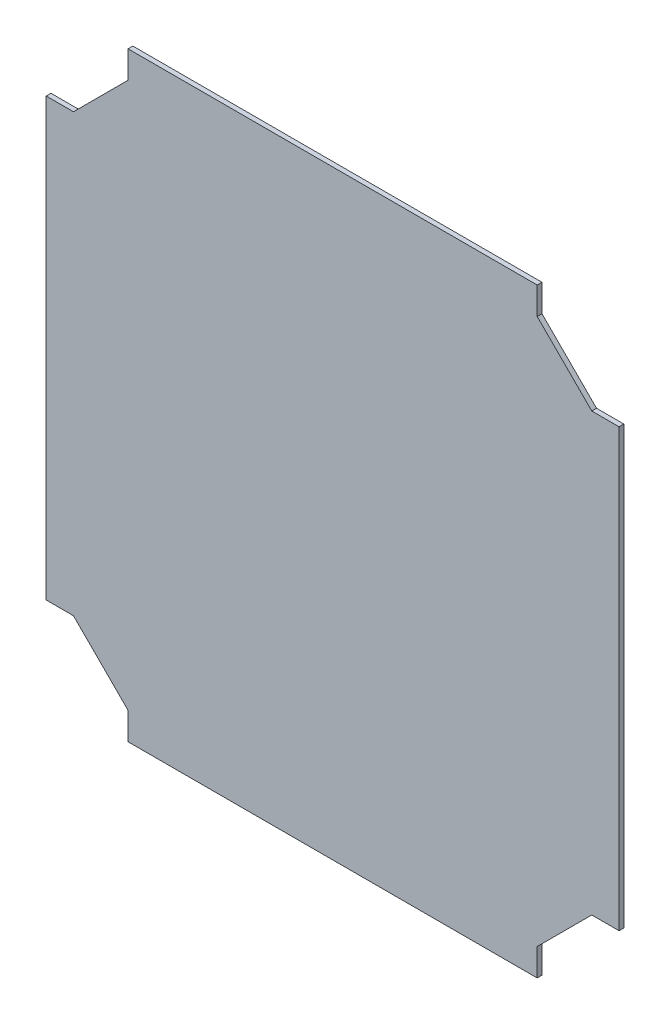
ISO-10303-21;
HEADER;
FILE_DESCRIPTION(('STEP AP214'),'2;1');
FILE_NAME('part.step','',(''),(''),'','','');
FILE_SCHEMA(('AUTOMOTIVE_DESIGN { 1 0 10303 214 1 1 1 1 }'));
ENDSEC;
DATA;
#1=APPLICATION_CONTEXT('core data for automotive mechanical design processes');
#2=APPLICATION_PROTOCOL_DEFINITION('international standard','automotive_design',2000,#1);
#3=PRODUCT_CONTEXT('',#1,'mechanical');
#4=PRODUCT('Part','Part','',(#3));
#5=PRODUCT_RELATED_PRODUCT_CATEGORY('part','',(#4));
#6=PRODUCT_DEFINITION_FORMATION('','',#4);
#7=PRODUCT_DEFINITION_CONTEXT('part definition',#1,'design');
#8=PRODUCT_DEFINITION('design','',#6,#7);
#9=PRODUCT_DEFINITION_SHAPE('','',#8);
#10=(LENGTH_UNIT() NAMED_UNIT(*) SI_UNIT(.MILLI.,.METRE.));
#11=(NAMED_UNIT(*) PLANE_ANGLE_UNIT() SI_UNIT($,.RADIAN.));
#12=(NAMED_UNIT(*) SI_UNIT($,.STERADIAN.) SOLID_ANGLE_UNIT());
#13=UNCERTAINTY_MEASURE_WITH_UNIT(LENGTH_MEASURE(1.E-05),#10,'distance_accuracy_value','');
#14=(GEOMETRIC_REPRESENTATION_CONTEXT(3) GLOBAL_UNCERTAINTY_ASSIGNED_CONTEXT((#13)) GLOBAL_UNIT_ASSIGNED_CONTEXT((#10,
#11,#12)) REPRESENTATION_CONTEXT('',''));
#15=CARTESIAN_POINT('',(0.,0.,0.));
#16=DIRECTION('',(0.,0.,1.));
#17=DIRECTION('',(1.,0.,0.));
#18=AXIS2_PLACEMENT_3D('',#15,#16,#17);
#19=CARTESIAN_POINT('',(-74.4468485132246,419.999999999776,3.5));
#20=DIRECTION('',(1.,1.5404344466475E-13,0.));
#21=DIRECTION('',(-1.5404344466475E-13,1.,0.));
#22=AXIS2_PLACEMENT_3D('',#19,#20,#21);
#23=PLANE('',#22);
#24=DIRECTION('',(1.5404344466475E-13,-1.,0.));
#25=VECTOR('',#24,1.);
#26=CARTESIAN_POINT('',(-74.4468485132246,419.999999999776,0.));
#27=LINE('',#26,#25);
#28=CARTESIAN_POINT('',(-74.4468485132277,440.000000000034,0.));
#29=VERTEX_POINT('',#28);
#30=CARTESIAN_POINT('',(-74.4468485132246,419.999999999776,0.));
#31=VERTEX_POINT('',#30);
#32=EDGE_CURVE('E176',#29,#31,#27,.T.);
#33=ORIENTED_EDGE('',*,*,#32,.T.);
#34=DIRECTION('',(0.,0.,-1.));
#35=VECTOR('',#34,1.);
#36=CARTESIAN_POINT('',(-74.4468485132246,419.999999999776,3.5));
#37=LINE('',#36,#35);
#38=CARTESIAN_POINT('',(-74.4468485132246,419.999999999776,3.5));
#39=VERTEX_POINT('',#38);
#40=EDGE_CURVE('E11',#39,#31,#37,.T.);
#41=ORIENTED_EDGE('',*,*,#40,.F.);
#42=DIRECTION('',(1.5404344466475E-13,-1.,0.));
#43=VECTOR('',#42,1.);
#44=CARTESIAN_POINT('',(-74.4468485132246,419.999999999776,3.5));
#45=LINE('',#44,#43);
#46=CARTESIAN_POINT('',(-74.4468485132277,440.000000000034,3.5));
#47=VERTEX_POINT('',#46);
#48=EDGE_CURVE('E207',#47,#39,#45,.T.);
#49=ORIENTED_EDGE('',*,*,#48,.F.);
#50=DIRECTION('',(0.,0.,-1.));
#51=VECTOR('',#50,1.);
#52=CARTESIAN_POINT('',(-74.4468485132277,440.000000000034,3.5));
#53=LINE('',#52,#51);
#54=EDGE_CURVE('E172',#47,#29,#53,.T.);
#55=ORIENTED_EDGE('',*,*,#54,.T.);
#56=EDGE_LOOP('',(#33,#41,#49,#55));
#57=FACE_BOUND('',#56,.T.);
#58=ADVANCED_FACE('F32',(#57),#23,.F.);
#59=CARTESIAN_POINT('',(-114.446848512919,380.000000000058,3.5));
#60=DIRECTION('',(0.707106781186745,-0.70710678118635,0.));
#61=DIRECTION('',(0.70710678118635,0.707106781186745,0.));
#62=AXIS2_PLACEMENT_3D('',#59,#60,#61);
#63=PLANE('',#62);
#64=DIRECTION('',(-0.70710678118635,-0.707106781186745,0.));
#65=VECTOR('',#64,1.);
#66=CARTESIAN_POINT('',(-114.446848512919,380.000000000058,0.));
#67=LINE('',#66,#65);
#68=CARTESIAN_POINT('',(-114.446848512919,380.000000000058,0.));
#69=VERTEX_POINT('',#68);
#70=EDGE_CURVE('E179',#31,#69,#67,.T.);
#71=ORIENTED_EDGE('',*,*,#70,.T.);
#72=DIRECTION('',(0.,0.,-1.));
#73=VECTOR('',#72,1.);
#74=CARTESIAN_POINT('',(-114.446848512919,380.000000000058,3.5));
#75=LINE('',#74,#73);
#76=CARTESIAN_POINT('',(-114.446848512919,380.000000000058,3.5));
#77=VERTEX_POINT('',#76);
#78=EDGE_CURVE('E40',#77,#69,#75,.T.);
#79=ORIENTED_EDGE('',*,*,#78,.F.);
#80=DIRECTION('',(-0.70710678118635,-0.707106781186745,0.));
#81=VECTOR('',#80,1.);
#82=CARTESIAN_POINT('',(-114.446848512919,380.000000000058,3.5));
#83=LINE('',#82,#81);
#84=EDGE_CURVE('E115',#39,#77,#83,.T.);
#85=ORIENTED_EDGE('',*,*,#84,.F.);
#86=ORIENTED_EDGE('',*,*,#40,.T.);
#87=EDGE_LOOP('',(#71,#79,#85,#86));
#88=FACE_BOUND('',#87,.T.);
#89=ADVANCED_FACE('F305',(#88),#63,.F.);
#90=CARTESIAN_POINT('',(-134.446848512876,380.000000000059,3.5));
#91=DIRECTION('',(0.,-1.,0.));
#92=DIRECTION('',(1.,0.,0.));
#93=AXIS2_PLACEMENT_3D('',#90,#91,#92);
#94=PLANE('',#93);
#95=DIRECTION('',(-1.,0.,0.));
#96=VECTOR('',#95,1.);
#97=CARTESIAN_POINT('',(-134.446848512876,380.000000000059,0.));
#98=LINE('',#97,#96);
#99=CARTESIAN_POINT('',(-134.446848512876,380.000000000059,0.));
#100=VERTEX_POINT('',#99);
#101=EDGE_CURVE('E181',#69,#100,#98,.T.);
#102=ORIENTED_EDGE('',*,*,#101,.T.);
#103=DIRECTION('',(0.,0.,-1.));
#104=VECTOR('',#103,1.);
#105=CARTESIAN_POINT('',(-134.446848512876,380.000000000059,3.5));
#106=LINE('',#105,#104);
#107=CARTESIAN_POINT('',(-134.446848512876,380.000000000059,3.5));
#108=VERTEX_POINT('',#107);
#109=EDGE_CURVE('E238',#108,#100,#106,.T.);
#110=ORIENTED_EDGE('',*,*,#109,.F.);
#111=DIRECTION('',(-1.,0.,0.));
#112=VECTOR('',#111,1.);
#113=CARTESIAN_POINT('',(-134.446848512876,380.000000000059,3.5));
#114=LINE('',#113,#112);
#115=EDGE_CURVE('E246',#77,#108,#114,.T.);
#116=ORIENTED_EDGE('',*,*,#115,.F.);
#117=ORIENTED_EDGE('',*,*,#78,.T.);
#118=EDGE_LOOP('',(#102,#110,#116,#117));
#119=FACE_BOUND('',#118,.T.);
#120=ADVANCED_FACE('F244',(#119),#94,.F.);
#121=CARTESIAN_POINT('',(-134.446848512876,60.0000000000639,3.5));
#122=DIRECTION('',(1.,0.,0.));
#123=DIRECTION('',(0.,1.,0.));
#124=AXIS2_PLACEMENT_3D('',#121,#122,#123);
#125=PLANE('',#124);
#126=DIRECTION('',(0.,-1.,0.));
#127=VECTOR('',#126,1.);
#128=CARTESIAN_POINT('',(-134.446848512876,60.0000000000639,0.));
#129=LINE('',#128,#127);
#130=CARTESIAN_POINT('',(-134.446848512876,60.0000000000639,0.));
#131=VERTEX_POINT('',#130);
#132=EDGE_CURVE('E183',#100,#131,#129,.T.);
#133=ORIENTED_EDGE('',*,*,#132,.T.);
#134=DIRECTION('',(0.,0.,-1.));
#135=VECTOR('',#134,1.);
#136=CARTESIAN_POINT('',(-134.446848512876,60.0000000000639,3.5));
#137=LINE('',#136,#135);
#138=CARTESIAN_POINT('',(-134.446848512876,60.0000000000639,3.5));
#139=VERTEX_POINT('',#138);
#140=EDGE_CURVE('E235',#139,#131,#137,.T.);
#141=ORIENTED_EDGE('',*,*,#140,.F.);
#142=DIRECTION('',(0.,-1.,0.));
#143=VECTOR('',#142,1.);
#144=CARTESIAN_POINT('',(-134.446848512876,60.0000000000639,3.5));
#145=LINE('',#144,#143);
#146=EDGE_CURVE('E264',#108,#139,#145,.T.);
#147=ORIENTED_EDGE('',*,*,#146,.F.);
#148=ORIENTED_EDGE('',*,*,#109,.T.);
#149=EDGE_LOOP('',(#133,#141,#147,#148));
#150=FACE_BOUND('',#149,.T.);
#151=ADVANCED_FACE('F255',(#150),#125,.F.);
#152=CARTESIAN_POINT('',(-114.446848512873,60.0000000000639,3.5));
#153=DIRECTION('',(0.,1.,0.));
#154=DIRECTION('',(0.,0.,1.));
#155=AXIS2_PLACEMENT_3D('',#152,#153,#154);
#156=PLANE('',#155);
#157=DIRECTION('',(1.,0.,0.));
#158=VECTOR('',#157,1.);
#159=CARTESIAN_POINT('',(-114.446848512873,60.0000000000639,0.));
#160=LINE('',#159,#158);
#161=CARTESIAN_POINT('',(-114.446848512873,60.0000000000639,0.));
#162=VERTEX_POINT('',#161);
#163=EDGE_CURVE('E185',#131,#162,#160,.T.);
#164=ORIENTED_EDGE('',*,*,#163,.T.);
#165=DIRECTION('',(0.,0.,-1.));
#166=VECTOR('',#165,1.);
#167=CARTESIAN_POINT('',(-114.446848512873,60.0000000000639,3.5));
#168=LINE('',#167,#166);
#169=CARTESIAN_POINT('',(-114.446848512873,60.0000000000639,3.5));
#170=VERTEX_POINT('',#169);
#171=EDGE_CURVE('E232',#170,#162,#168,.T.);
#172=ORIENTED_EDGE('',*,*,#171,.F.);
#173=DIRECTION('',(1.,0.,0.));
#174=VECTOR('',#173,1.);
#175=CARTESIAN_POINT('',(-114.446848512873,60.0000000000639,3.5));
#176=LINE('',#175,#174);
#177=EDGE_CURVE('E261',#139,#170,#176,.T.);
#178=ORIENTED_EDGE('',*,*,#177,.F.);
#179=ORIENTED_EDGE('',*,*,#140,.T.);
#180=EDGE_LOOP('',(#164,#172,#178,#179));
#181=FACE_BOUND('',#180,.T.);
#182=ADVANCED_FACE('F259',(#181),#156,.F.);
#183=CARTESIAN_POINT('',(-74.4468485128761,20.0000000000889,3.5));
#184=DIRECTION('',(0.70710678118635,0.707106781186745,0.));
#185=DIRECTION('',(-0.707106781186745,0.70710678118635,0.));
#186=AXIS2_PLACEMENT_3D('',#183,#184,#185);
#187=PLANE('',#186);
#188=DIRECTION('',(0.707106781186745,-0.70710678118635,0.));
#189=VECTOR('',#188,1.);
#190=CARTESIAN_POINT('',(-74.4468485128761,20.0000000000889,0.));
#191=LINE('',#190,#189);
#192=CARTESIAN_POINT('',(-74.4468485128761,20.0000000000889,0.));
#193=VERTEX_POINT('',#192);
#194=EDGE_CURVE('E187',#162,#193,#191,.T.);
#195=ORIENTED_EDGE('',*,*,#194,.T.);
#196=DIRECTION('',(0.,0.,-1.));
#197=VECTOR('',#196,1.);
#198=CARTESIAN_POINT('',(-74.4468485128761,20.0000000000889,3.5));
#199=LINE('',#198,#197);
#200=CARTESIAN_POINT('',(-74.4468485128761,20.0000000000889,3.5));
#201=VERTEX_POINT('',#200);
#202=EDGE_CURVE('E229',#201,#193,#199,.T.);
#203=ORIENTED_EDGE('',*,*,#202,.F.);
#204=DIRECTION('',(0.707106781186745,-0.70710678118635,0.));
#205=VECTOR('',#204,1.);
#206=CARTESIAN_POINT('',(-74.4468485128761,20.0000000000889,3.5));
#207=LINE('',#206,#205);
#208=EDGE_CURVE('E263',#170,#201,#207,.T.);
#209=ORIENTED_EDGE('',*,*,#208,.F.);
#210=ORIENTED_EDGE('',*,*,#171,.T.);
#211=EDGE_LOOP('',(#195,#203,#209,#210));
#212=FACE_BOUND('',#211,.T.);
#213=ADVANCED_FACE('F318',(#212),#187,.F.);
#214=CARTESIAN_POINT('',(-74.4468485128761,-4.73422112382014E-12,3.5));
#215=DIRECTION('',(1.,0.,0.));
#216=DIRECTION('',(0.,0.,-1.));
#217=AXIS2_PLACEMENT_3D('',#214,#215,#216);
#218=PLANE('',#217);
#219=DIRECTION('',(0.,-1.,0.));
#220=VECTOR('',#219,1.);
#221=CARTESIAN_POINT('',(-74.4468485128761,-4.73422112382014E-12,0.));
#222=LINE('',#221,#220);
#223=CARTESIAN_POINT('',(-74.4468485128761,-4.73422112382014E-12,0.));
#224=VERTEX_POINT('',#223);
#225=EDGE_CURVE('E189',#193,#224,#222,.T.);
#226=ORIENTED_EDGE('',*,*,#225,.T.);
#227=DIRECTION('',(0.,0.,-1.));
#228=VECTOR('',#227,1.);
#229=CARTESIAN_POINT('',(-74.4468485128761,-4.73422112382014E-12,3.5));
#230=LINE('',#229,#228);
#231=CARTESIAN_POINT('',(-74.4468485128761,-4.73422112382014E-12,3.5));
#232=VERTEX_POINT('',#231);
#233=EDGE_CURVE('E226',#232,#224,#230,.T.);
#234=ORIENTED_EDGE('',*,*,#233,.F.);
#235=DIRECTION('',(0.,-1.,0.));
#236=VECTOR('',#235,1.);
#237=CARTESIAN_POINT('',(-74.4468485128761,-4.73422112382014E-12,3.5));
#238=LINE('',#237,#236);
#239=EDGE_CURVE('E266',#201,#232,#238,.T.);
#240=ORIENTED_EDGE('',*,*,#239,.F.);
#241=ORIENTED_EDGE('',*,*,#202,.T.);
#242=EDGE_LOOP('',(#226,#234,#240,#241));
#243=FACE_BOUND('',#242,.T.);
#244=ADVANCED_FACE('F321',(#243),#218,.F.);
#245=CARTESIAN_POINT('',(0.,0.,3.5));
#246=DIRECTION('',(0.,1.,0.));
#247=DIRECTION('',(-1.,0.,0.));
#248=AXIS2_PLACEMENT_3D('',#245,#246,#247);
#249=PLANE('',#248);
#250=DIRECTION('',(1.,0.,0.));
#251=VECTOR('',#250,1.);
#252=CARTESIAN_POINT('',(0.,0.,0.));
#253=LINE('',#252,#251);
#254=CARTESIAN_POINT('',(225.553151487123,-4.69748171984573E-12,0.));
#255=VERTEX_POINT('',#254);
#256=EDGE_CURVE('E192',#224,#255,#253,.T.);
#257=ORIENTED_EDGE('',*,*,#256,.T.);
#258=DIRECTION('',(0.,0.,-1.));
#259=VECTOR('',#258,1.);
#260=CARTESIAN_POINT('',(225.553151487123,-4.69748171984573E-12,3.5));
#261=LINE('',#260,#259);
#262=CARTESIAN_POINT('',(225.553151487123,-4.69748171984573E-12,3.5));
#263=VERTEX_POINT('',#262);
#264=EDGE_CURVE('E223',#263,#255,#261,.T.);
#265=ORIENTED_EDGE('',*,*,#264,.F.);
#266=DIRECTION('',(1.,0.,0.));
#267=VECTOR('',#266,1.);
#268=CARTESIAN_POINT('',(-74.4468485128761,-4.73422112382014E-12,3.5));
#269=LINE('',#268,#267);
#270=EDGE_CURVE('E272',#232,#263,#269,.T.);
#271=ORIENTED_EDGE('',*,*,#270,.F.);
#272=ORIENTED_EDGE('',*,*,#233,.T.);
#273=EDGE_LOOP('',(#257,#265,#271,#272));
#274=FACE_BOUND('',#273,.T.);
#275=ADVANCED_FACE('F325',(#274),#249,.F.);
#276=CARTESIAN_POINT('',(225.553151487123,20.000000000064,3.5));
#277=DIRECTION('',(-1.,0.,0.));
#278=DIRECTION('',(0.,0.,1.));
#279=AXIS2_PLACEMENT_3D('',#276,#277,#278);
#280=PLANE('',#279);
#281=DIRECTION('',(0.,1.,0.));
#282=VECTOR('',#281,1.);
#283=CARTESIAN_POINT('',(225.553151487123,20.000000000064,0.));
#284=LINE('',#283,#282);
#285=CARTESIAN_POINT('',(225.553151487123,20.000000000064,0.));
#286=VERTEX_POINT('',#285);
#287=EDGE_CURVE('E194',#255,#286,#284,.T.);
#288=ORIENTED_EDGE('',*,*,#287,.T.);
#289=DIRECTION('',(0.,0.,-1.));
#290=VECTOR('',#289,1.);
#291=CARTESIAN_POINT('',(225.553151487123,20.000000000064,3.5));
#292=LINE('',#291,#290);
#293=CARTESIAN_POINT('',(225.553151487123,20.000000000064,3.5));
#294=VERTEX_POINT('',#293);
#295=EDGE_CURVE('E220',#294,#286,#292,.T.);
#296=ORIENTED_EDGE('',*,*,#295,.F.);
#297=DIRECTION('',(0.,1.,0.));
#298=VECTOR('',#297,1.);
#299=CARTESIAN_POINT('',(225.553151487123,20.000000000064,3.5));
#300=LINE('',#299,#298);
#301=EDGE_CURVE('E274',#263,#294,#300,.T.);
#302=ORIENTED_EDGE('',*,*,#301,.F.);
#303=ORIENTED_EDGE('',*,*,#264,.T.);
#304=EDGE_LOOP('',(#288,#296,#302,#303));
#305=FACE_BOUND('',#304,.T.);
#306=ADVANCED_FACE('F329',(#305),#280,.F.);
#307=CARTESIAN_POINT('',(265.553151487073,60.0000000000393,3.5));
#308=DIRECTION('',(-0.707106781186773,0.707106781186322,0.));
#309=DIRECTION('',(-0.707106781186322,-0.707106781186773,0.));
#310=AXIS2_PLACEMENT_3D('',#307,#308,#309);
#311=PLANE('',#310);
#312=DIRECTION('',(0.707106781186322,0.707106781186773,0.));
#313=VECTOR('',#312,1.);
#314=CARTESIAN_POINT('',(265.553151487073,60.0000000000393,0.));
#315=LINE('',#314,#313);
#316=CARTESIAN_POINT('',(265.553151487073,60.0000000000393,0.));
#317=VERTEX_POINT('',#316);
#318=EDGE_CURVE('E196',#286,#317,#315,.T.);
#319=ORIENTED_EDGE('',*,*,#318,.T.);
#320=DIRECTION('',(0.,0.,-1.));
#321=VECTOR('',#320,1.);
#322=CARTESIAN_POINT('',(265.553151487073,60.0000000000393,3.5));
#323=LINE('',#322,#321);
#324=CARTESIAN_POINT('',(265.553151487073,60.0000000000393,3.5));
#325=VERTEX_POINT('',#324);
#326=EDGE_CURVE('E217',#325,#317,#323,.T.);
#327=ORIENTED_EDGE('',*,*,#326,.F.);
#328=DIRECTION('',(0.707106781186322,0.707106781186773,0.));
#329=VECTOR('',#328,1.);
#330=CARTESIAN_POINT('',(265.553151487073,60.0000000000393,3.5));
#331=LINE('',#330,#329);
#332=EDGE_CURVE('E276',#294,#325,#331,.T.);
#333=ORIENTED_EDGE('',*,*,#332,.F.);
#334=ORIENTED_EDGE('',*,*,#295,.T.);
#335=EDGE_LOOP('',(#319,#327,#333,#334));
#336=FACE_BOUND('',#335,.T.);
#337=ADVANCED_FACE('F333',(#336),#311,.F.);
#338=CARTESIAN_POINT('',(285.553151487212,60.000000000039,3.5));
#339=DIRECTION('',(0.,1.,0.));
#340=DIRECTION('',(-1.,0.,0.));
#341=AXIS2_PLACEMENT_3D('',#338,#339,#340);
#342=PLANE('',#341);
#343=DIRECTION('',(1.,0.,0.));
#344=VECTOR('',#343,1.);
#345=CARTESIAN_POINT('',(285.553151487212,60.000000000039,0.));
#346=LINE('',#345,#344);
#347=CARTESIAN_POINT('',(285.553151487212,60.000000000039,0.));
#348=VERTEX_POINT('',#347);
#349=EDGE_CURVE('E198',#317,#348,#346,.T.);
#350=ORIENTED_EDGE('',*,*,#349,.T.);
#351=DIRECTION('',(0.,0.,-1.));
#352=VECTOR('',#351,1.);
#353=CARTESIAN_POINT('',(285.553151487212,60.000000000039,3.5));
#354=LINE('',#353,#352);
#355=CARTESIAN_POINT('',(285.553151487212,60.000000000039,3.5));
#356=VERTEX_POINT('',#355);
#357=EDGE_CURVE('E214',#356,#348,#354,.T.);
#358=ORIENTED_EDGE('',*,*,#357,.F.);
#359=DIRECTION('',(1.,0.,0.));
#360=VECTOR('',#359,1.);
#361=CARTESIAN_POINT('',(285.553151487212,60.000000000039,3.5));
#362=LINE('',#361,#360);
#363=EDGE_CURVE('E278',#325,#356,#362,.T.);
#364=ORIENTED_EDGE('',*,*,#363,.F.);
#365=ORIENTED_EDGE('',*,*,#326,.T.);
#366=EDGE_LOOP('',(#350,#358,#364,#365));
#367=FACE_BOUND('',#366,.T.);
#368=ADVANCED_FACE('F337',(#367),#342,.F.);
#369=CARTESIAN_POINT('',(285.553151487212,380.000000000038,3.5));
#370=DIRECTION('',(-1.,0.,0.));
#371=DIRECTION('',(0.,-1.,0.));
#372=AXIS2_PLACEMENT_3D('',#369,#370,#371);
#373=PLANE('',#372);
#374=DIRECTION('',(0.,1.,0.));
#375=VECTOR('',#374,1.);
#376=CARTESIAN_POINT('',(285.553151487212,380.000000000038,0.));
#377=LINE('',#376,#375);
#378=CARTESIAN_POINT('',(285.553151487212,380.000000000038,0.));
#379=VERTEX_POINT('',#378);
#380=EDGE_CURVE('E200',#348,#379,#377,.T.);
#381=ORIENTED_EDGE('',*,*,#380,.T.);
#382=DIRECTION('',(0.,0.,-1.));
#383=VECTOR('',#382,1.);
#384=CARTESIAN_POINT('',(285.553151487212,380.000000000038,3.5));
#385=LINE('',#384,#383);
#386=CARTESIAN_POINT('',(285.553151487212,380.000000000038,3.5));
#387=VERTEX_POINT('',#386);
#388=EDGE_CURVE('E211',#387,#379,#385,.T.);
#389=ORIENTED_EDGE('',*,*,#388,.F.);
#390=DIRECTION('',(0.,1.,0.));
#391=VECTOR('',#390,1.);
#392=CARTESIAN_POINT('',(285.553151487212,380.000000000038,3.5));
#393=LINE('',#392,#391);
#394=EDGE_CURVE('E280',#356,#387,#393,.T.);
#395=ORIENTED_EDGE('',*,*,#394,.F.);
#396=ORIENTED_EDGE('',*,*,#357,.T.);
#397=EDGE_LOOP('',(#381,#389,#395,#396));
#398=FACE_BOUND('',#397,.T.);
#399=ADVANCED_FACE('F286',(#398),#373,.F.);
#400=CARTESIAN_POINT('',(265.55315148725,380.000000000039,3.5));
#401=DIRECTION('',(0.,-1.,0.));
#402=DIRECTION('',(1.,0.,0.));
#403=AXIS2_PLACEMENT_3D('',#400,#401,#402);
#404=PLANE('',#403);
#405=DIRECTION('',(-1.,0.,0.));
#406=VECTOR('',#405,1.);
#407=CARTESIAN_POINT('',(265.55315148725,380.000000000039,0.));
#408=LINE('',#407,#406);
#409=CARTESIAN_POINT('',(265.55315148725,380.000000000039,0.));
#410=VERTEX_POINT('',#409);
#411=EDGE_CURVE('E202',#379,#410,#408,.T.);
#412=ORIENTED_EDGE('',*,*,#411,.T.);
#413=DIRECTION('',(0.,0.,-1.));
#414=VECTOR('',#413,1.);
#415=CARTESIAN_POINT('',(265.55315148725,380.000000000039,3.5));
#416=LINE('',#415,#414);
#417=CARTESIAN_POINT('',(265.55315148725,380.000000000039,3.5));
#418=VERTEX_POINT('',#417);
#419=EDGE_CURVE('E167',#418,#410,#416,.T.);
#420=ORIENTED_EDGE('',*,*,#419,.F.);
#421=DIRECTION('',(-1.,0.,0.));
#422=VECTOR('',#421,1.);
#423=CARTESIAN_POINT('',(265.55315148725,380.000000000039,3.5));
#424=LINE('',#423,#422);
#425=EDGE_CURVE('E158',#387,#418,#424,.T.);
#426=ORIENTED_EDGE('',*,*,#425,.F.);
#427=ORIENTED_EDGE('',*,*,#388,.T.);
#428=EDGE_LOOP('',(#412,#420,#426,#427));
#429=FACE_BOUND('',#428,.T.);
#430=ADVANCED_FACE('F290',(#429),#404,.F.);
#431=CARTESIAN_POINT('',(225.553151486093,420.000000001174,3.5));
#432=DIRECTION('',(-0.707106781186349,-0.707106781186746,0.));
#433=DIRECTION('',(0.707106781186746,-0.707106781186349,0.));
#434=AXIS2_PLACEMENT_3D('',#431,#432,#433);
#435=PLANE('',#434);
#436=DIRECTION('',(-0.707106781186746,0.707106781186349,0.));
#437=VECTOR('',#436,1.);
#438=CARTESIAN_POINT('',(225.553151486093,420.000000001174,0.));
#439=LINE('',#438,#437);
#440=CARTESIAN_POINT('',(225.553151486093,420.000000001174,0.));
#441=VERTEX_POINT('',#440);
#442=EDGE_CURVE('E166',#410,#441,#439,.T.);
#443=ORIENTED_EDGE('',*,*,#442,.T.);
#444=DIRECTION('',(0.,0.,-1.));
#445=VECTOR('',#444,1.);
#446=CARTESIAN_POINT('',(225.553151486093,420.000000001174,3.5));
#447=LINE('',#446,#445);
#448=CARTESIAN_POINT('',(225.553151486093,420.000000001174,3.5));
#449=VERTEX_POINT('',#448);
#450=EDGE_CURVE('E163',#449,#441,#447,.T.);
#451=ORIENTED_EDGE('',*,*,#450,.F.);
#452=DIRECTION('',(-0.707106781186746,0.707106781186349,0.));
#453=VECTOR('',#452,1.);
#454=CARTESIAN_POINT('',(225.553151486093,420.000000001174,3.5));
#455=LINE('',#454,#453);
#456=EDGE_CURVE('E152',#418,#449,#455,.T.);
#457=ORIENTED_EDGE('',*,*,#456,.F.);
#458=ORIENTED_EDGE('',*,*,#419,.T.);
#459=EDGE_LOOP('',(#443,#451,#457,#458));
#460=FACE_BOUND('',#459,.T.);
#461=ADVANCED_FACE('F164',(#460),#435,.F.);
#462=CARTESIAN_POINT('',(225.553151486093,440.000000000034,3.5));
#463=DIRECTION('',(-1.,0.,0.));
#464=DIRECTION('',(0.,-1.,0.));
#465=AXIS2_PLACEMENT_3D('',#462,#463,#464);
#466=PLANE('',#465);
#467=DIRECTION('',(0.,1.,0.));
#468=VECTOR('',#467,1.);
#469=CARTESIAN_POINT('',(225.553151486093,440.000000000034,0.));
#470=LINE('',#469,#468);
#471=CARTESIAN_POINT('',(225.553151486093,440.000000000034,0.));
#472=VERTEX_POINT('',#471);
#473=EDGE_CURVE('E101',#441,#472,#470,.T.);
#474=ORIENTED_EDGE('',*,*,#473,.T.);
#475=DIRECTION('',(0.,0.,-1.));
#476=VECTOR('',#475,1.);
#477=CARTESIAN_POINT('',(225.553151486093,440.000000000034,3.5));
#478=LINE('',#477,#476);
#479=CARTESIAN_POINT('',(225.553151486093,440.000000000034,3.5));
#480=VERTEX_POINT('',#479);
#481=EDGE_CURVE('E168',#480,#472,#478,.T.);
#482=ORIENTED_EDGE('',*,*,#481,.F.);
#483=DIRECTION('',(0.,1.,0.));
#484=VECTOR('',#483,1.);
#485=CARTESIAN_POINT('',(225.553151486093,440.000000000034,3.5));
#486=LINE('',#485,#484);
#487=EDGE_CURVE('E156',#449,#480,#486,.T.);
#488=ORIENTED_EDGE('',*,*,#487,.F.);
#489=ORIENTED_EDGE('',*,*,#450,.T.);
#490=EDGE_LOOP('',(#474,#482,#488,#489));
#491=FACE_BOUND('',#490,.T.);
#492=ADVANCED_FACE('F170',(#491),#466,.F.);
#493=CARTESIAN_POINT('',(-74.4468485132277,440.000000000034,3.5));
#494=DIRECTION('',(0.,-1.,0.));
#495=DIRECTION('',(0.,0.,-1.));
#496=AXIS2_PLACEMENT_3D('',#493,#494,#495);
#497=PLANE('',#496);
#498=DIRECTION('',(-1.,0.,0.));
#499=VECTOR('',#498,1.);
#500=CARTESIAN_POINT('',(-74.4468485132277,440.000000000034,0.));
#501=LINE('',#500,#499);
#502=EDGE_CURVE('E107',#472,#29,#501,.T.);
#503=ORIENTED_EDGE('',*,*,#502,.T.);
#504=ORIENTED_EDGE('',*,*,#54,.F.);
#505=DIRECTION('',(-1.,0.,0.));
#506=VECTOR('',#505,1.);
#507=CARTESIAN_POINT('',(-74.4468485132277,440.000000000034,3.5));
#508=LINE('',#507,#506);
#509=EDGE_CURVE('E48',#480,#47,#508,.T.);
#510=ORIENTED_EDGE('',*,*,#509,.F.);
#511=ORIENTED_EDGE('',*,*,#481,.T.);
#512=EDGE_LOOP('',(#503,#504,#510,#511));
#513=FACE_BOUND('',#512,.T.);
#514=ADVANCED_FACE('F294',(#513),#497,.F.);
#515=CARTESIAN_POINT('',(0.,0.,3.5));
#516=DIRECTION('',(0.,0.,-1.));
#517=DIRECTION('',(-1.,0.,0.));
#518=AXIS2_PLACEMENT_3D('',#515,#516,#517);
#519=PLANE('',#518);
#520=ORIENTED_EDGE('',*,*,#48,.T.);
#521=ORIENTED_EDGE('',*,*,#84,.T.);
#522=ORIENTED_EDGE('',*,*,#115,.T.);
#523=ORIENTED_EDGE('',*,*,#146,.T.);
#524=ORIENTED_EDGE('',*,*,#177,.T.);
#525=ORIENTED_EDGE('',*,*,#208,.T.);
#526=ORIENTED_EDGE('',*,*,#239,.T.);
#527=ORIENTED_EDGE('',*,*,#270,.T.);
#528=ORIENTED_EDGE('',*,*,#301,.T.);
#529=ORIENTED_EDGE('',*,*,#332,.T.);
#530=ORIENTED_EDGE('',*,*,#363,.T.);
#531=ORIENTED_EDGE('',*,*,#394,.T.);
#532=ORIENTED_EDGE('',*,*,#425,.T.);
#533=ORIENTED_EDGE('',*,*,#456,.T.);
#534=ORIENTED_EDGE('',*,*,#487,.T.);
#535=ORIENTED_EDGE('',*,*,#509,.T.);
#536=EDGE_LOOP('',(#520,#521,#522,#523,#524,#525,#526,#527,#528,#529,#530,#531,#532,#533,#534,#535));
#537=FACE_BOUND('',#536,.T.);
#538=ADVANCED_FACE('F154',(#537),#519,.F.);
#539=CARTESIAN_POINT('',(0.,0.,0.));
#540=DIRECTION('',(0.,0.,-1.));
#541=DIRECTION('',(-1.,0.,0.));
#542=AXIS2_PLACEMENT_3D('',#539,#540,#541);
#543=PLANE('',#542);
#544=ORIENTED_EDGE('',*,*,#32,.F.);
#545=ORIENTED_EDGE('',*,*,#502,.F.);
#546=ORIENTED_EDGE('',*,*,#473,.F.);
#547=ORIENTED_EDGE('',*,*,#442,.F.);
#548=ORIENTED_EDGE('',*,*,#411,.F.);
#549=ORIENTED_EDGE('',*,*,#380,.F.);
#550=ORIENTED_EDGE('',*,*,#349,.F.);
#551=ORIENTED_EDGE('',*,*,#318,.F.);
#552=ORIENTED_EDGE('',*,*,#287,.F.);
#553=ORIENTED_EDGE('',*,*,#256,.F.);
#554=ORIENTED_EDGE('',*,*,#225,.F.);
#555=ORIENTED_EDGE('',*,*,#194,.F.);
#556=ORIENTED_EDGE('',*,*,#163,.F.);
#557=ORIENTED_EDGE('',*,*,#132,.F.);
#558=ORIENTED_EDGE('',*,*,#101,.F.);
#559=ORIENTED_EDGE('',*,*,#70,.F.);
#560=EDGE_LOOP('',(#544,#545,#546,#547,#548,#549,#550,#551,#552,#553,#554,#555,#556,#557,#558,#559));
#561=FACE_BOUND('',#560,.T.);
#562=ADVANCED_FACE('F250',(#561),#543,.T.);
#563=CLOSED_SHELL('',(#58,#89,#120,#151,#182,#213,#244,#275,#306,#337,#368,#399,#430,#461,#492,
#514,#538,#562));
#564=MANIFOLD_SOLID_BREP('B2',#563);
#565=ADVANCED_BREP_SHAPE_REPRESENTATION('',(#18,#564),#14);
#566=SHAPE_DEFINITION_REPRESENTATION(#9,#565);
ENDSEC;
END-ISO-10303-21;
